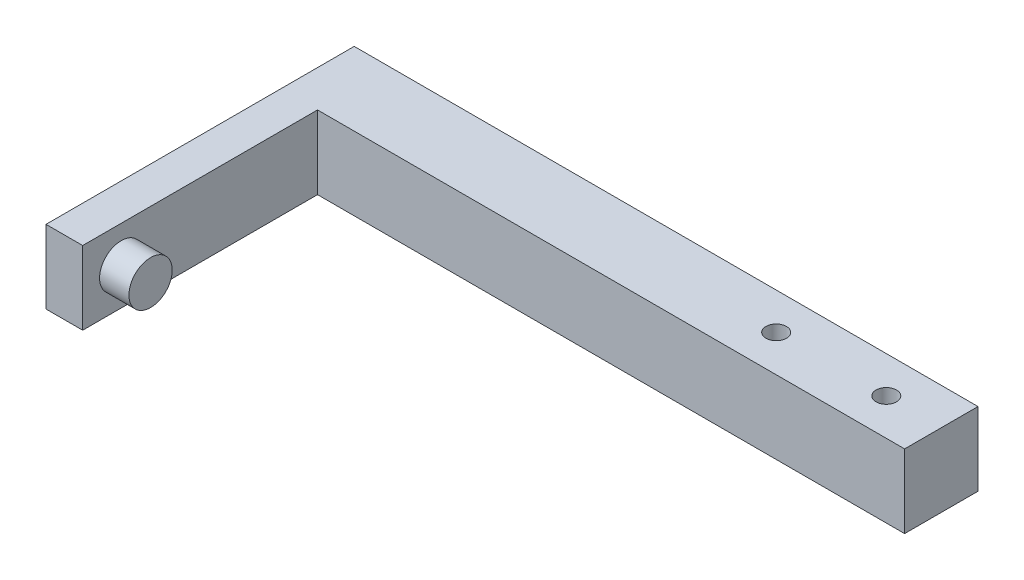
ISO-10303-21;
HEADER;
FILE_DESCRIPTION(('STEP AP214'),'2;1');
FILE_NAME('part.step','',(''),(''),'','','');
FILE_SCHEMA(('AUTOMOTIVE_DESIGN { 1 0 10303 214 1 1 1 1 }'));
ENDSEC;
DATA;
#1=APPLICATION_CONTEXT('core data for automotive mechanical design processes');
#2=APPLICATION_PROTOCOL_DEFINITION('international standard','automotive_design',2000,#1);
#3=PRODUCT_CONTEXT('',#1,'mechanical');
#4=PRODUCT('Part','Part','',(#3));
#5=PRODUCT_RELATED_PRODUCT_CATEGORY('part','',(#4));
#6=PRODUCT_DEFINITION_FORMATION('','',#4);
#7=PRODUCT_DEFINITION_CONTEXT('part definition',#1,'design');
#8=PRODUCT_DEFINITION('design','',#6,#7);
#9=PRODUCT_DEFINITION_SHAPE('','',#8);
#10=(LENGTH_UNIT() NAMED_UNIT(*) SI_UNIT(.MILLI.,.METRE.));
#11=(NAMED_UNIT(*) PLANE_ANGLE_UNIT() SI_UNIT($,.RADIAN.));
#12=(NAMED_UNIT(*) SI_UNIT($,.STERADIAN.) SOLID_ANGLE_UNIT());
#13=UNCERTAINTY_MEASURE_WITH_UNIT(LENGTH_MEASURE(1.E-05),#10,'distance_accuracy_value','');
#14=(GEOMETRIC_REPRESENTATION_CONTEXT(3) GLOBAL_UNCERTAINTY_ASSIGNED_CONTEXT((#13)) GLOBAL_UNIT_ASSIGNED_CONTEXT((#10,
#11,#12)) REPRESENTATION_CONTEXT('',''));
#15=CARTESIAN_POINT('',(0.,0.,0.));
#16=DIRECTION('',(0.,0.,1.));
#17=DIRECTION('',(1.,0.,0.));
#18=AXIS2_PLACEMENT_3D('',#15,#16,#17);
#19=CARTESIAN_POINT('',(-42.5,10.,5.));
#20=DIRECTION('',(0.,0.,-1.));
#21=DIRECTION('',(-1.,0.,0.));
#22=AXIS2_PLACEMENT_3D('',#19,#20,#21);
#23=PLANE('',#22);
#24=DIRECTION('',(0.,1.,0.));
#25=VECTOR('',#24,1.);
#26=CARTESIAN_POINT('',(-37.5,10.,5.));
#27=LINE('',#26,#25);
#28=CARTESIAN_POINT('',(-37.5,0.,5.));
#29=VERTEX_POINT('',#28);
#30=CARTESIAN_POINT('',(-37.5,10.,5.));
#31=VERTEX_POINT('',#30);
#32=EDGE_CURVE('E54',#29,#31,#27,.T.);
#33=ORIENTED_EDGE('',*,*,#32,.F.);
#34=DIRECTION('',(1.,0.,0.));
#35=VECTOR('',#34,1.);
#36=CARTESIAN_POINT('',(-42.5,0.,5.));
#37=LINE('',#36,#35);
#38=CARTESIAN_POINT('',(42.5,0.,5.));
#39=VERTEX_POINT('',#38);
#40=EDGE_CURVE('E107',#29,#39,#37,.T.);
#41=ORIENTED_EDGE('',*,*,#40,.T.);
#42=DIRECTION('',(0.,-1.,0.));
#43=VECTOR('',#42,1.);
#44=CARTESIAN_POINT('',(42.5,10.,5.));
#45=LINE('',#44,#43);
#46=CARTESIAN_POINT('',(42.5,10.,5.));
#47=VERTEX_POINT('',#46);
#48=EDGE_CURVE('E47',#47,#39,#45,.T.);
#49=ORIENTED_EDGE('',*,*,#48,.F.);
#50=DIRECTION('',(1.,0.,0.));
#51=VECTOR('',#50,1.);
#52=CARTESIAN_POINT('',(-42.5,10.,5.));
#53=LINE('',#52,#51);
#54=EDGE_CURVE('E83',#31,#47,#53,.T.);
#55=ORIENTED_EDGE('',*,*,#54,.F.);
#56=EDGE_LOOP('',(#33,#41,#49,#55));
#57=FACE_BOUND('',#56,.T.);
#58=ADVANCED_FACE('F39',(#57),#23,.F.);
#59=CARTESIAN_POINT('',(-42.5,10.,-5.));
#60=DIRECTION('',(1.,0.,0.));
#61=DIRECTION('',(0.,0.,-1.));
#62=AXIS2_PLACEMENT_3D('',#59,#60,#61);
#63=PLANE('',#62);
#64=DIRECTION('',(0.,0.,1.));
#65=VECTOR('',#64,1.);
#66=CARTESIAN_POINT('',(-42.5,0.,-5.));
#67=LINE('',#66,#65);
#68=CARTESIAN_POINT('',(-42.5,0.,-5.));
#69=VERTEX_POINT('',#68);
#70=CARTESIAN_POINT('',(-42.5,0.,37.));
#71=VERTEX_POINT('',#70);
#72=EDGE_CURVE('E100',#69,#71,#67,.T.);
#73=ORIENTED_EDGE('',*,*,#72,.T.);
#74=DIRECTION('',(0.,-1.,0.));
#75=VECTOR('',#74,1.);
#76=CARTESIAN_POINT('',(-42.5,10.,37.));
#77=LINE('',#76,#75);
#78=CARTESIAN_POINT('',(-42.5,10.,37.));
#79=VERTEX_POINT('',#78);
#80=EDGE_CURVE('E104',#79,#71,#77,.T.);
#81=ORIENTED_EDGE('',*,*,#80,.F.);
#82=DIRECTION('',(0.,0.,1.));
#83=VECTOR('',#82,1.);
#84=CARTESIAN_POINT('',(-42.5,10.,-5.));
#85=LINE('',#84,#83);
#86=CARTESIAN_POINT('',(-42.5,10.,-5.));
#87=VERTEX_POINT('',#86);
#88=EDGE_CURVE('E144',#87,#79,#85,.T.);
#89=ORIENTED_EDGE('',*,*,#88,.F.);
#90=DIRECTION('',(0.,-1.,0.));
#91=VECTOR('',#90,1.);
#92=CARTESIAN_POINT('',(-42.5,10.,-5.));
#93=LINE('',#92,#91);
#94=EDGE_CURVE('E105',#87,#69,#93,.T.);
#95=ORIENTED_EDGE('',*,*,#94,.T.);
#96=EDGE_LOOP('',(#73,#81,#89,#95));
#97=FACE_BOUND('',#96,.T.);
#98=ADVANCED_FACE('F41',(#97),#63,.F.);
#99=CARTESIAN_POINT('',(42.5,10.,-5.));
#100=DIRECTION('',(-1.,0.,0.));
#101=DIRECTION('',(0.,0.,1.));
#102=AXIS2_PLACEMENT_3D('',#99,#100,#101);
#103=PLANE('',#102);
#104=DIRECTION('',(0.,0.,-1.));
#105=VECTOR('',#104,1.);
#106=CARTESIAN_POINT('',(42.5,0.,-5.));
#107=LINE('',#106,#105);
#108=CARTESIAN_POINT('',(42.5,0.,-5.));
#109=VERTEX_POINT('',#108);
#110=EDGE_CURVE('E151',#39,#109,#107,.T.);
#111=ORIENTED_EDGE('',*,*,#110,.T.);
#112=DIRECTION('',(0.,-1.,0.));
#113=VECTOR('',#112,1.);
#114=CARTESIAN_POINT('',(42.5,10.,-5.));
#115=LINE('',#114,#113);
#116=CARTESIAN_POINT('',(42.5,10.,-5.));
#117=VERTEX_POINT('',#116);
#118=EDGE_CURVE('E155',#117,#109,#115,.T.);
#119=ORIENTED_EDGE('',*,*,#118,.F.);
#120=DIRECTION('',(0.,0.,-1.));
#121=VECTOR('',#120,1.);
#122=CARTESIAN_POINT('',(42.5,10.,-5.));
#123=LINE('',#122,#121);
#124=EDGE_CURVE('E147',#47,#117,#123,.T.);
#125=ORIENTED_EDGE('',*,*,#124,.F.);
#126=ORIENTED_EDGE('',*,*,#48,.T.);
#127=EDGE_LOOP('',(#111,#119,#125,#126));
#128=FACE_BOUND('',#127,.T.);
#129=ADVANCED_FACE('F160',(#128),#103,.F.);
#130=CARTESIAN_POINT('',(-42.5,10.,-5.));
#131=DIRECTION('',(0.,0.,1.));
#132=DIRECTION('',(1.,0.,0.));
#133=AXIS2_PLACEMENT_3D('',#130,#131,#132);
#134=PLANE('',#133);
#135=DIRECTION('',(-1.,0.,0.));
#136=VECTOR('',#135,1.);
#137=CARTESIAN_POINT('',(-42.5,0.,-5.));
#138=LINE('',#137,#136);
#139=EDGE_CURVE('E79',#109,#69,#138,.T.);
#140=ORIENTED_EDGE('',*,*,#139,.T.);
#141=ORIENTED_EDGE('',*,*,#94,.F.);
#142=DIRECTION('',(-1.,0.,0.));
#143=VECTOR('',#142,1.);
#144=CARTESIAN_POINT('',(-42.5,10.,-5.));
#145=LINE('',#144,#143);
#146=EDGE_CURVE('E63',#117,#87,#145,.T.);
#147=ORIENTED_EDGE('',*,*,#146,.F.);
#148=ORIENTED_EDGE('',*,*,#118,.T.);
#149=EDGE_LOOP('',(#140,#141,#147,#148));
#150=FACE_BOUND('',#149,.T.);
#151=ADVANCED_FACE('F167',(#150),#134,.F.);
#152=CARTESIAN_POINT('',(0.,10.,0.));
#153=DIRECTION('',(0.,1.,0.));
#154=DIRECTION('',(0.,0.,1.));
#155=AXIS2_PLACEMENT_3D('',#152,#153,#154);
#156=PLANE('',#155);
#157=CARTESIAN_POINT('',(35.,10.,0.));
#158=DIRECTION('',(0.,1.,0.));
#159=DIRECTION('',(0.,0.,1.));
#160=AXIS2_PLACEMENT_3D('',#157,#158,#159);
#161=CIRCLE('',#160,1.4);
#162=CARTESIAN_POINT('',(35.,10.,1.4));
#163=VERTEX_POINT('',#162);
#164=EDGE_CURVE('E136',#163,#163,#161,.T.);
#165=ORIENTED_EDGE('',*,*,#164,.F.);
#166=EDGE_LOOP('',(#165));
#167=FACE_BOUND('',#166,.T.);
#168=CARTESIAN_POINT('',(20.,10.,0.));
#169=DIRECTION('',(0.,1.,0.));
#170=DIRECTION('',(0.,0.,1.));
#171=AXIS2_PLACEMENT_3D('',#168,#169,#170);
#172=CIRCLE('',#171,1.4);
#173=CARTESIAN_POINT('',(20.,10.,1.4));
#174=VERTEX_POINT('',#173);
#175=EDGE_CURVE('E139',#174,#174,#172,.T.);
#176=ORIENTED_EDGE('',*,*,#175,.F.);
#177=EDGE_LOOP('',(#176));
#178=FACE_BOUND('',#177,.T.);
#179=ORIENTED_EDGE('',*,*,#88,.T.);
#180=DIRECTION('',(-1.,0.,0.));
#181=VECTOR('',#180,1.);
#182=CARTESIAN_POINT('',(-42.5,10.,37.));
#183=LINE('',#182,#181);
#184=CARTESIAN_POINT('',(-37.5,10.,37.));
#185=VERTEX_POINT('',#184);
#186=EDGE_CURVE('E122',#185,#79,#183,.T.);
#187=ORIENTED_EDGE('',*,*,#186,.F.);
#188=DIRECTION('',(0.,0.,-1.));
#189=VECTOR('',#188,1.);
#190=CARTESIAN_POINT('',(-37.5,10.,37.));
#191=LINE('',#190,#189);
#192=EDGE_CURVE('E129',#185,#31,#191,.T.);
#193=ORIENTED_EDGE('',*,*,#192,.T.);
#194=ORIENTED_EDGE('',*,*,#54,.T.);
#195=ORIENTED_EDGE('',*,*,#124,.T.);
#196=ORIENTED_EDGE('',*,*,#146,.T.);
#197=EDGE_LOOP('',(#179,#187,#193,#194,#195,#196));
#198=FACE_BOUND('',#197,.T.);
#199=ADVANCED_FACE('F165',(#167,#178,#198),#156,.T.);
#200=CARTESIAN_POINT('',(0.,0.,0.));
#201=DIRECTION('',(0.,1.,0.));
#202=DIRECTION('',(0.,0.,1.));
#203=AXIS2_PLACEMENT_3D('',#200,#201,#202);
#204=PLANE('',#203);
#205=CARTESIAN_POINT('',(35.,0.,0.));
#206=DIRECTION('',(0.,1.,0.));
#207=DIRECTION('',(0.,0.,1.));
#208=AXIS2_PLACEMENT_3D('',#205,#206,#207);
#209=CIRCLE('',#208,1.4);
#210=CARTESIAN_POINT('',(35.,0.,1.4));
#211=VERTEX_POINT('',#210);
#212=EDGE_CURVE('E108',#211,#211,#209,.T.);
#213=ORIENTED_EDGE('',*,*,#212,.T.);
#214=EDGE_LOOP('',(#213));
#215=FACE_BOUND('',#214,.T.);
#216=CARTESIAN_POINT('',(20.,0.,0.));
#217=DIRECTION('',(0.,1.,0.));
#218=DIRECTION('',(0.,0.,1.));
#219=AXIS2_PLACEMENT_3D('',#216,#217,#218);
#220=CIRCLE('',#219,1.4);
#221=CARTESIAN_POINT('',(20.,0.,1.4));
#222=VERTEX_POINT('',#221);
#223=EDGE_CURVE('E133',#222,#222,#220,.T.);
#224=ORIENTED_EDGE('',*,*,#223,.T.);
#225=EDGE_LOOP('',(#224));
#226=FACE_BOUND('',#225,.T.);
#227=ORIENTED_EDGE('',*,*,#72,.F.);
#228=ORIENTED_EDGE('',*,*,#139,.F.);
#229=ORIENTED_EDGE('',*,*,#110,.F.);
#230=ORIENTED_EDGE('',*,*,#40,.F.);
#231=DIRECTION('',(0.,0.,-1.));
#232=VECTOR('',#231,1.);
#233=CARTESIAN_POINT('',(-37.5,0.,37.));
#234=LINE('',#233,#232);
#235=CARTESIAN_POINT('',(-37.5,0.,37.));
#236=VERTEX_POINT('',#235);
#237=EDGE_CURVE('E114',#236,#29,#234,.T.);
#238=ORIENTED_EDGE('',*,*,#237,.F.);
#239=DIRECTION('',(1.,0.,0.));
#240=VECTOR('',#239,1.);
#241=CARTESIAN_POINT('',(-42.5,0.,37.));
#242=LINE('',#241,#240);
#243=EDGE_CURVE('E111',#71,#236,#242,.T.);
#244=ORIENTED_EDGE('',*,*,#243,.F.);
#245=EDGE_LOOP('',(#227,#228,#229,#230,#238,#244));
#246=FACE_BOUND('',#245,.T.);
#247=ADVANCED_FACE('F112',(#215,#226,#246),#204,.F.);
#248=CARTESIAN_POINT('',(20.,0.,0.));
#249=DIRECTION('',(0.,1.,0.));
#250=DIRECTION('',(0.,0.,1.));
#251=AXIS2_PLACEMENT_3D('',#248,#249,#250);
#252=CYLINDRICAL_SURFACE('',#251,1.4);
#253=ORIENTED_EDGE('',*,*,#223,.F.);
#254=EDGE_LOOP('',(#253));
#255=FACE_BOUND('',#254,.T.);
#256=ORIENTED_EDGE('',*,*,#175,.T.);
#257=EDGE_LOOP('',(#256));
#258=FACE_BOUND('',#257,.T.);
#259=ADVANCED_FACE('F174',(#255,#258),#252,.F.);
#260=CARTESIAN_POINT('',(35.,0.,0.));
#261=DIRECTION('',(0.,1.,0.));
#262=DIRECTION('',(0.,0.,1.));
#263=AXIS2_PLACEMENT_3D('',#260,#261,#262);
#264=CYLINDRICAL_SURFACE('',#263,1.4);
#265=ORIENTED_EDGE('',*,*,#212,.F.);
#266=EDGE_LOOP('',(#265));
#267=FACE_BOUND('',#266,.T.);
#268=ORIENTED_EDGE('',*,*,#164,.T.);
#269=EDGE_LOOP('',(#268));
#270=FACE_BOUND('',#269,.T.);
#271=ADVANCED_FACE('F203',(#267,#270),#264,.F.);
#272=CARTESIAN_POINT('',(-37.5,10.,37.));
#273=DIRECTION('',(-1.,0.,0.));
#274=DIRECTION('',(0.,0.,1.));
#275=AXIS2_PLACEMENT_3D('',#272,#273,#274);
#276=PLANE('',#275);
#277=CARTESIAN_POINT('',(-37.5,5.,31.75));
#278=DIRECTION('',(-1.,0.,0.));
#279=DIRECTION('',(0.,0.,1.));
#280=AXIS2_PLACEMENT_3D('',#277,#278,#279);
#281=CIRCLE('',#280,2.95);
#282=CARTESIAN_POINT('',(-37.5,5.,34.7));
#283=VERTEX_POINT('',#282);
#284=EDGE_CURVE('E11',#283,#283,#281,.F.);
#285=ORIENTED_EDGE('',*,*,#284,.F.);
#286=EDGE_LOOP('',(#285));
#287=FACE_BOUND('',#286,.T.);
#288=ORIENTED_EDGE('',*,*,#32,.T.);
#289=ORIENTED_EDGE('',*,*,#192,.F.);
#290=DIRECTION('',(0.,1.,0.));
#291=VECTOR('',#290,1.);
#292=CARTESIAN_POINT('',(-37.5,10.,37.));
#293=LINE('',#292,#291);
#294=EDGE_CURVE('E117',#236,#185,#293,.T.);
#295=ORIENTED_EDGE('',*,*,#294,.F.);
#296=ORIENTED_EDGE('',*,*,#237,.T.);
#297=EDGE_LOOP('',(#288,#289,#295,#296));
#298=FACE_BOUND('',#297,.T.);
#299=ADVANCED_FACE('F163',(#287,#298),#276,.F.);
#300=CARTESIAN_POINT('',(0.,0.,37.));
#301=DIRECTION('',(0.,0.,1.));
#302=DIRECTION('',(1.,0.,0.));
#303=AXIS2_PLACEMENT_3D('',#300,#301,#302);
#304=PLANE('',#303);
#305=ORIENTED_EDGE('',*,*,#80,.T.);
#306=ORIENTED_EDGE('',*,*,#243,.T.);
#307=ORIENTED_EDGE('',*,*,#294,.T.);
#308=ORIENTED_EDGE('',*,*,#186,.T.);
#309=EDGE_LOOP('',(#305,#306,#307,#308));
#310=FACE_BOUND('',#309,.T.);
#311=ADVANCED_FACE('F120',(#310),#304,.T.);
#312=CARTESIAN_POINT('',(-33.5,5.,31.75));
#313=DIRECTION('',(-1.,0.,0.));
#314=DIRECTION('',(0.,0.,1.));
#315=AXIS2_PLACEMENT_3D('',#312,#313,#314);
#316=CYLINDRICAL_SURFACE('',#315,2.95);
#317=CARTESIAN_POINT('',(-33.5,5.,31.75));
#318=DIRECTION('',(1.,0.,0.));
#319=DIRECTION('',(0.,0.,-1.));
#320=AXIS2_PLACEMENT_3D('',#317,#318,#319);
#321=CIRCLE('',#320,2.95);
#322=CARTESIAN_POINT('',(-33.5,5.,28.8));
#323=VERTEX_POINT('',#322);
#324=EDGE_CURVE('E124',#323,#323,#321,.T.);
#325=ORIENTED_EDGE('',*,*,#324,.F.);
#326=EDGE_LOOP('',(#325));
#327=FACE_BOUND('',#326,.T.);
#328=ORIENTED_EDGE('',*,*,#284,.T.);
#329=EDGE_LOOP('',(#328));
#330=FACE_BOUND('',#329,.T.);
#331=ADVANCED_FACE('F256',(#327,#330),#316,.T.);
#332=CARTESIAN_POINT('',(-33.5,5.,31.75));
#333=DIRECTION('',(1.,0.,0.));
#334=DIRECTION('',(0.,0.,-1.));
#335=AXIS2_PLACEMENT_3D('',#332,#333,#334);
#336=PLANE('',#335);
#337=ORIENTED_EDGE('',*,*,#324,.T.);
#338=EDGE_LOOP('',(#337));
#339=FACE_BOUND('',#338,.T.);
#340=ADVANCED_FACE('F264',(#339),#336,.T.);
#341=CLOSED_SHELL('',(#58,#98,#129,#151,#199,#247,#259,#271,#299,#311,#331,#340));
#342=MANIFOLD_SOLID_BREP('B2',#341);
#343=ADVANCED_BREP_SHAPE_REPRESENTATION('',(#18,#342),#14);
#344=SHAPE_DEFINITION_REPRESENTATION(#9,#343);
ENDSEC;
END-ISO-10303-21;
